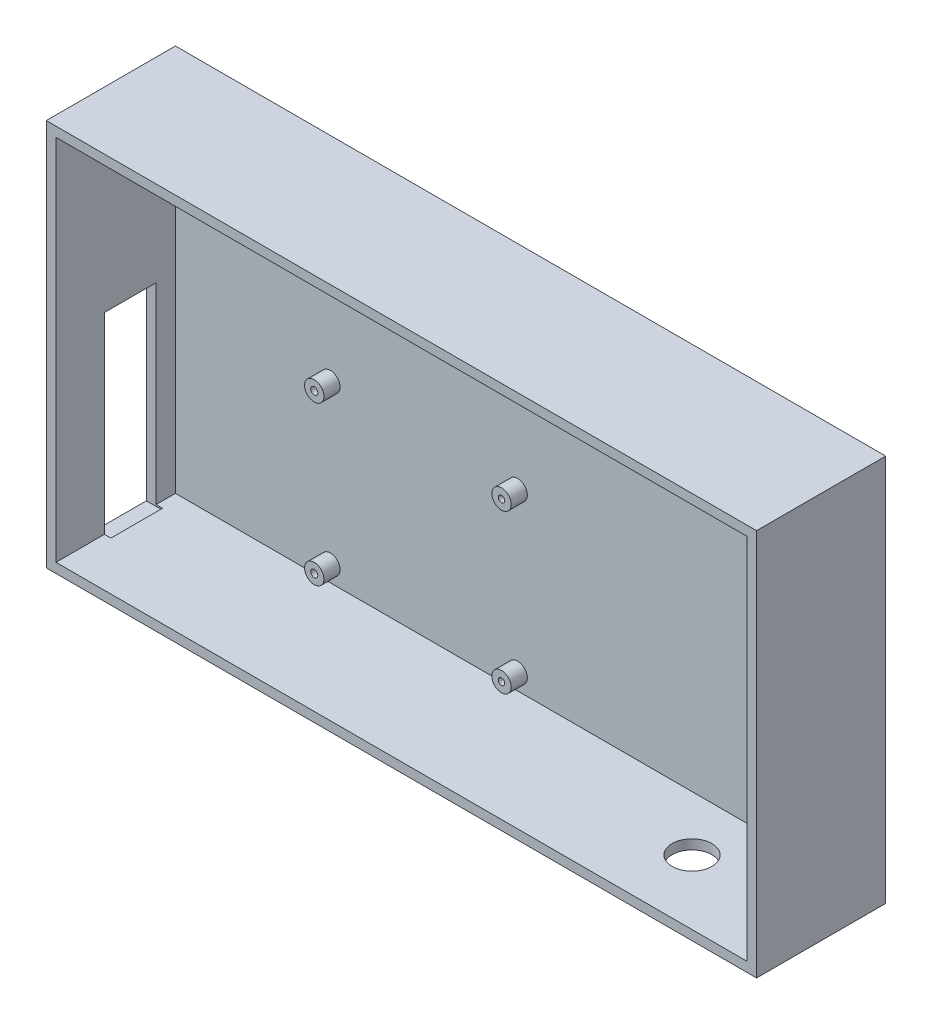
ISO-10303-21;
HEADER;
FILE_DESCRIPTION(('STEP AP214'),'2;1');
FILE_NAME('part.step','',(''),(''),'','','');
FILE_SCHEMA(('AUTOMOTIVE_DESIGN { 1 0 10303 214 1 1 1 1 }'));
ENDSEC;
DATA;
#1=APPLICATION_CONTEXT('core data for automotive mechanical design processes');
#2=APPLICATION_PROTOCOL_DEFINITION('international standard','automotive_design',2000,#1);
#3=PRODUCT_CONTEXT('',#1,'mechanical');
#4=PRODUCT('Part','Part','',(#3));
#5=PRODUCT_RELATED_PRODUCT_CATEGORY('part','',(#4));
#6=PRODUCT_DEFINITION_FORMATION('','',#4);
#7=PRODUCT_DEFINITION_CONTEXT('part definition',#1,'design');
#8=PRODUCT_DEFINITION('design','',#6,#7);
#9=PRODUCT_DEFINITION_SHAPE('','',#8);
#10=(LENGTH_UNIT() NAMED_UNIT(*) SI_UNIT(.MILLI.,.METRE.));
#11=(NAMED_UNIT(*) PLANE_ANGLE_UNIT() SI_UNIT($,.RADIAN.));
#12=(NAMED_UNIT(*) SI_UNIT($,.STERADIAN.) SOLID_ANGLE_UNIT());
#13=UNCERTAINTY_MEASURE_WITH_UNIT(LENGTH_MEASURE(1.E-05),#10,'distance_accuracy_value','');
#14=(GEOMETRIC_REPRESENTATION_CONTEXT(3) GLOBAL_UNCERTAINTY_ASSIGNED_CONTEXT((#13)) GLOBAL_UNIT_ASSIGNED_CONTEXT((#10,
#11,#12)) REPRESENTATION_CONTEXT('',''));
#15=CARTESIAN_POINT('',(0.,0.,0.));
#16=DIRECTION('',(0.,0.,1.));
#17=DIRECTION('',(1.,0.,0.));
#18=AXIS2_PLACEMENT_3D('',#15,#16,#17);
#19=CARTESIAN_POINT('',(-110.,-60.,40.));
#20=DIRECTION('',(1.,0.,0.));
#21=DIRECTION('',(0.,0.,-1.));
#22=AXIS2_PLACEMENT_3D('',#19,#20,#21);
#23=PLANE('',#22);
#24=DIRECTION('',(0.,-1.,0.));
#25=VECTOR('',#24,1.);
#26=CARTESIAN_POINT('',(-110.,-60.,0.));
#27=LINE('',#26,#25);
#28=CARTESIAN_POINT('',(-110.,60.,0.));
#29=VERTEX_POINT('',#28);
#30=CARTESIAN_POINT('',(-110.,-60.,0.));
#31=VERTEX_POINT('',#30);
#32=EDGE_CURVE('E248',#29,#31,#27,.T.);
#33=ORIENTED_EDGE('',*,*,#32,.T.);
#34=DIRECTION('',(0.,0.,-1.));
#35=VECTOR('',#34,1.);
#36=CARTESIAN_POINT('',(-110.,-60.,40.));
#37=LINE('',#36,#35);
#38=CARTESIAN_POINT('',(-110.,-60.,40.));
#39=VERTEX_POINT('',#38);
#40=EDGE_CURVE('E274',#39,#31,#37,.T.);
#41=ORIENTED_EDGE('',*,*,#40,.F.);
#42=DIRECTION('',(0.,-1.,0.));
#43=VECTOR('',#42,1.);
#44=CARTESIAN_POINT('',(-110.,-60.,40.));
#45=LINE('',#44,#43);
#46=CARTESIAN_POINT('',(-110.,60.,40.));
#47=VERTEX_POINT('',#46);
#48=EDGE_CURVE('E247',#47,#39,#45,.T.);
#49=ORIENTED_EDGE('',*,*,#48,.F.);
#50=DIRECTION('',(0.,0.,-1.));
#51=VECTOR('',#50,1.);
#52=CARTESIAN_POINT('',(-110.,60.,40.));
#53=LINE('',#52,#51);
#54=EDGE_CURVE('E259',#47,#29,#53,.T.);
#55=ORIENTED_EDGE('',*,*,#54,.T.);
#56=EDGE_LOOP('',(#33,#41,#49,#55));
#57=FACE_BOUND('',#56,.T.);
#58=DIRECTION('',(0.,1.,0.));
#59=VECTOR('',#58,1.);
#60=CARTESIAN_POINT('',(-110.,-60.,25.));
#61=LINE('',#60,#59);
#62=CARTESIAN_POINT('',(-110.,-57.5,25.));
#63=VERTEX_POINT('',#62);
#64=CARTESIAN_POINT('',(-110.,2.5,25.));
#65=VERTEX_POINT('',#64);
#66=EDGE_CURVE('E175',#63,#65,#61,.T.);
#67=ORIENTED_EDGE('',*,*,#66,.F.);
#68=DIRECTION('',(0.,0.,1.));
#69=VECTOR('',#68,1.);
#70=CARTESIAN_POINT('',(-110.,-57.5,40.));
#71=LINE('',#70,#69);
#72=CARTESIAN_POINT('',(-110.,-57.5,9.));
#73=VERTEX_POINT('',#72);
#74=EDGE_CURVE('E11',#73,#63,#71,.T.);
#75=ORIENTED_EDGE('',*,*,#74,.F.);
#76=DIRECTION('',(0.,1.,0.));
#77=VECTOR('',#76,1.);
#78=CARTESIAN_POINT('',(-110.,-60.,9.));
#79=LINE('',#78,#77);
#80=CARTESIAN_POINT('',(-110.,2.5,9.));
#81=VERTEX_POINT('',#80);
#82=EDGE_CURVE('E170',#73,#81,#79,.T.);
#83=ORIENTED_EDGE('',*,*,#82,.T.);
#84=DIRECTION('',(0.,0.,-1.));
#85=VECTOR('',#84,1.);
#86=CARTESIAN_POINT('',(-110.,2.5,40.));
#87=LINE('',#86,#85);
#88=EDGE_CURVE('E173',#65,#81,#87,.T.);
#89=ORIENTED_EDGE('',*,*,#88,.F.);
#90=EDGE_LOOP('',(#67,#75,#83,#89));
#91=FACE_BOUND('',#90,.T.);
#92=ADVANCED_FACE('F39',(#57,#91),#23,.F.);
#93=CARTESIAN_POINT('',(-107.,-57.,40.));
#94=DIRECTION('',(1.,0.,0.));
#95=DIRECTION('',(0.,0.,-1.));
#96=AXIS2_PLACEMENT_3D('',#93,#94,#95);
#97=PLANE('',#96);
#98=DIRECTION('',(0.,0.,-1.));
#99=VECTOR('',#98,1.);
#100=CARTESIAN_POINT('',(-107.,-57.,40.));
#101=LINE('',#100,#99);
#102=CARTESIAN_POINT('',(-107.,-57.,40.));
#103=VERTEX_POINT('',#102);
#104=CARTESIAN_POINT('',(-107.,-57.,25.));
#105=VERTEX_POINT('',#104);
#106=EDGE_CURVE('E243',#103,#105,#101,.T.);
#107=ORIENTED_EDGE('',*,*,#106,.T.);
#108=DIRECTION('',(0.,1.,0.));
#109=VECTOR('',#108,1.);
#110=CARTESIAN_POINT('',(-107.,-57.,25.));
#111=LINE('',#110,#109);
#112=CARTESIAN_POINT('',(-107.,2.5,25.));
#113=VERTEX_POINT('',#112);
#114=EDGE_CURVE('E168',#105,#113,#111,.T.);
#115=ORIENTED_EDGE('',*,*,#114,.T.);
#116=DIRECTION('',(0.,0.,-1.));
#117=VECTOR('',#116,1.);
#118=CARTESIAN_POINT('',(-107.,2.5,40.));
#119=LINE('',#118,#117);
#120=CARTESIAN_POINT('',(-107.,2.5,9.));
#121=VERTEX_POINT('',#120);
#122=EDGE_CURVE('E46',#113,#121,#119,.T.);
#123=ORIENTED_EDGE('',*,*,#122,.T.);
#124=DIRECTION('',(0.,1.,0.));
#125=VECTOR('',#124,1.);
#126=CARTESIAN_POINT('',(-107.,-57.,9.));
#127=LINE('',#126,#125);
#128=CARTESIAN_POINT('',(-107.,-57.,9.));
#129=VERTEX_POINT('',#128);
#130=EDGE_CURVE('E155',#129,#121,#127,.T.);
#131=ORIENTED_EDGE('',*,*,#130,.F.);
#132=CARTESIAN_POINT('',(-107.,-57.,3.));
#133=VERTEX_POINT('',#132);
#134=EDGE_CURVE('E241',#129,#133,#101,.T.);
#135=ORIENTED_EDGE('',*,*,#134,.T.);
#136=DIRECTION('',(0.,-1.,0.));
#137=VECTOR('',#136,1.);
#138=CARTESIAN_POINT('',(-107.,-57.,3.));
#139=LINE('',#138,#137);
#140=CARTESIAN_POINT('',(-107.,57.,3.));
#141=VERTEX_POINT('',#140);
#142=EDGE_CURVE('E220',#141,#133,#139,.T.);
#143=ORIENTED_EDGE('',*,*,#142,.F.);
#144=DIRECTION('',(0.,0.,-1.));
#145=VECTOR('',#144,1.);
#146=CARTESIAN_POINT('',(-107.,57.,40.));
#147=LINE('',#146,#145);
#148=CARTESIAN_POINT('',(-107.,57.,40.));
#149=VERTEX_POINT('',#148);
#150=EDGE_CURVE('E230',#149,#141,#147,.T.);
#151=ORIENTED_EDGE('',*,*,#150,.F.);
#152=DIRECTION('',(0.,-1.,0.));
#153=VECTOR('',#152,1.);
#154=CARTESIAN_POINT('',(-107.,-57.,40.));
#155=LINE('',#154,#153);
#156=EDGE_CURVE('E217',#149,#103,#155,.T.);
#157=ORIENTED_EDGE('',*,*,#156,.T.);
#158=EDGE_LOOP('',(#107,#115,#123,#131,#135,#143,#151,#157));
#159=FACE_BOUND('',#158,.T.);
#160=ADVANCED_FACE('F296',(#159),#97,.T.);
#161=CARTESIAN_POINT('',(-107.,-57.,40.));
#162=DIRECTION('',(0.,1.,0.));
#163=DIRECTION('',(0.,0.,1.));
#164=AXIS2_PLACEMENT_3D('',#161,#162,#163);
#165=PLANE('',#164);
#166=CARTESIAN_POINT('',(70.,-57.,20.));
#167=DIRECTION('',(0.,1.,0.));
#168=DIRECTION('',(0.,0.,1.));
#169=AXIS2_PLACEMENT_3D('',#166,#167,#168);
#170=CIRCLE('',#169,6.15000000000001);
#171=CARTESIAN_POINT('',(70.,-57.,26.15));
#172=VERTEX_POINT('',#171);
#173=EDGE_CURVE('E180',#172,#172,#170,.T.);
#174=ORIENTED_EDGE('',*,*,#173,.F.);
#175=EDGE_LOOP('',(#174));
#176=FACE_BOUND('',#175,.T.);
#177=DIRECTION('',(0.,0.,1.));
#178=VECTOR('',#177,1.);
#179=CARTESIAN_POINT('',(-105.,-57.,40.));
#180=LINE('',#179,#178);
#181=CARTESIAN_POINT('',(-105.,-57.,9.));
#182=VERTEX_POINT('',#181);
#183=CARTESIAN_POINT('',(-105.,-57.,25.));
#184=VERTEX_POINT('',#183);
#185=EDGE_CURVE('E294',#182,#184,#180,.T.);
#186=ORIENTED_EDGE('',*,*,#185,.T.);
#187=DIRECTION('',(-1.,0.,0.));
#188=VECTOR('',#187,1.);
#189=CARTESIAN_POINT('',(-107.,-57.,25.));
#190=LINE('',#189,#188);
#191=EDGE_CURVE('E160',#184,#105,#190,.T.);
#192=ORIENTED_EDGE('',*,*,#191,.T.);
#193=ORIENTED_EDGE('',*,*,#106,.F.);
#194=DIRECTION('',(1.,0.,0.));
#195=VECTOR('',#194,1.);
#196=CARTESIAN_POINT('',(-107.,-57.,40.));
#197=LINE('',#196,#195);
#198=CARTESIAN_POINT('',(107.,-57.,40.));
#199=VERTEX_POINT('',#198);
#200=EDGE_CURVE('E219',#103,#199,#197,.T.);
#201=ORIENTED_EDGE('',*,*,#200,.T.);
#202=DIRECTION('',(0.,0.,-1.));
#203=VECTOR('',#202,1.);
#204=CARTESIAN_POINT('',(107.,-57.,40.));
#205=LINE('',#204,#203);
#206=CARTESIAN_POINT('',(107.,-57.,3.));
#207=VERTEX_POINT('',#206);
#208=EDGE_CURVE('E242',#199,#207,#205,.T.);
#209=ORIENTED_EDGE('',*,*,#208,.T.);
#210=DIRECTION('',(1.,0.,0.));
#211=VECTOR('',#210,1.);
#212=CARTESIAN_POINT('',(-107.,-57.,3.));
#213=LINE('',#212,#211);
#214=EDGE_CURVE('E231',#133,#207,#213,.T.);
#215=ORIENTED_EDGE('',*,*,#214,.F.);
#216=ORIENTED_EDGE('',*,*,#134,.F.);
#217=DIRECTION('',(-1.,0.,0.));
#218=VECTOR('',#217,1.);
#219=CARTESIAN_POINT('',(-107.,-57.,9.));
#220=LINE('',#219,#218);
#221=EDGE_CURVE('E289',#182,#129,#220,.T.);
#222=ORIENTED_EDGE('',*,*,#221,.F.);
#223=EDGE_LOOP('',(#186,#192,#193,#201,#209,#215,#216,#222));
#224=FACE_BOUND('',#223,.T.);
#225=ADVANCED_FACE('F325',(#176,#224),#165,.T.);
#226=CARTESIAN_POINT('',(0.,0.,40.));
#227=DIRECTION('',(0.,0.,-1.));
#228=DIRECTION('',(-1.,0.,0.));
#229=AXIS2_PLACEMENT_3D('',#226,#227,#228);
#230=PLANE('',#229);
#231=ORIENTED_EDGE('',*,*,#48,.T.);
#232=DIRECTION('',(1.,0.,0.));
#233=VECTOR('',#232,1.);
#234=CARTESIAN_POINT('',(-110.,-60.,40.));
#235=LINE('',#234,#233);
#236=CARTESIAN_POINT('',(110.,-60.,40.));
#237=VERTEX_POINT('',#236);
#238=EDGE_CURVE('E252',#39,#237,#235,.T.);
#239=ORIENTED_EDGE('',*,*,#238,.T.);
#240=DIRECTION('',(0.,1.,0.));
#241=VECTOR('',#240,1.);
#242=CARTESIAN_POINT('',(110.,-60.,40.));
#243=LINE('',#242,#241);
#244=CARTESIAN_POINT('',(110.,60.,40.));
#245=VERTEX_POINT('',#244);
#246=EDGE_CURVE('E254',#237,#245,#243,.T.);
#247=ORIENTED_EDGE('',*,*,#246,.T.);
#248=DIRECTION('',(-1.,0.,0.));
#249=VECTOR('',#248,1.);
#250=CARTESIAN_POINT('',(-110.,60.,40.));
#251=LINE('',#250,#249);
#252=EDGE_CURVE('E260',#245,#47,#251,.T.);
#253=ORIENTED_EDGE('',*,*,#252,.T.);
#254=EDGE_LOOP('',(#231,#239,#247,#253));
#255=FACE_BOUND('',#254,.T.);
#256=ORIENTED_EDGE('',*,*,#156,.F.);
#257=DIRECTION('',(-1.,0.,0.));
#258=VECTOR('',#257,1.);
#259=CARTESIAN_POINT('',(-107.,57.,40.));
#260=LINE('',#259,#258);
#261=CARTESIAN_POINT('',(107.,57.,40.));
#262=VERTEX_POINT('',#261);
#263=EDGE_CURVE('E227',#262,#149,#260,.T.);
#264=ORIENTED_EDGE('',*,*,#263,.F.);
#265=DIRECTION('',(0.,1.,0.));
#266=VECTOR('',#265,1.);
#267=CARTESIAN_POINT('',(107.,-57.,40.));
#268=LINE('',#267,#266);
#269=EDGE_CURVE('E224',#199,#262,#268,.T.);
#270=ORIENTED_EDGE('',*,*,#269,.F.);
#271=ORIENTED_EDGE('',*,*,#200,.F.);
#272=EDGE_LOOP('',(#256,#264,#270,#271));
#273=FACE_BOUND('',#272,.T.);
#274=ADVANCED_FACE('F339',(#255,#273),#230,.F.);
#275=CARTESIAN_POINT('',(-110.,-60.,40.));
#276=DIRECTION('',(0.,1.,0.));
#277=DIRECTION('',(0.,0.,1.));
#278=AXIS2_PLACEMENT_3D('',#275,#276,#277);
#279=PLANE('',#278);
#280=CARTESIAN_POINT('',(70.,-60.,20.));
#281=DIRECTION('',(0.,1.,0.));
#282=DIRECTION('',(0.,0.,1.));
#283=AXIS2_PLACEMENT_3D('',#280,#281,#282);
#284=CIRCLE('',#283,6.15000000000001);
#285=CARTESIAN_POINT('',(70.,-60.,26.15));
#286=VERTEX_POINT('',#285);
#287=EDGE_CURVE('E178',#286,#286,#284,.T.);
#288=ORIENTED_EDGE('',*,*,#287,.T.);
#289=EDGE_LOOP('',(#288));
#290=FACE_BOUND('',#289,.T.);
#291=DIRECTION('',(1.,0.,0.));
#292=VECTOR('',#291,1.);
#293=CARTESIAN_POINT('',(-110.,-60.,0.));
#294=LINE('',#293,#292);
#295=CARTESIAN_POINT('',(110.,-60.,0.));
#296=VERTEX_POINT('',#295);
#297=EDGE_CURVE('E265',#31,#296,#294,.T.);
#298=ORIENTED_EDGE('',*,*,#297,.T.);
#299=DIRECTION('',(0.,0.,-1.));
#300=VECTOR('',#299,1.);
#301=CARTESIAN_POINT('',(110.,-60.,40.));
#302=LINE('',#301,#300);
#303=EDGE_CURVE('E275',#237,#296,#302,.T.);
#304=ORIENTED_EDGE('',*,*,#303,.F.);
#305=ORIENTED_EDGE('',*,*,#238,.F.);
#306=ORIENTED_EDGE('',*,*,#40,.T.);
#307=EDGE_LOOP('',(#298,#304,#305,#306));
#308=FACE_BOUND('',#307,.T.);
#309=ADVANCED_FACE('F331',(#290,#308),#279,.F.);
#310=CARTESIAN_POINT('',(110.,-60.,40.));
#311=DIRECTION('',(-1.,0.,0.));
#312=DIRECTION('',(0.,0.,1.));
#313=AXIS2_PLACEMENT_3D('',#310,#311,#312);
#314=PLANE('',#313);
#315=DIRECTION('',(0.,1.,0.));
#316=VECTOR('',#315,1.);
#317=CARTESIAN_POINT('',(110.,-60.,0.));
#318=LINE('',#317,#316);
#319=CARTESIAN_POINT('',(110.,60.,0.));
#320=VERTEX_POINT('',#319);
#321=EDGE_CURVE('E262',#296,#320,#318,.T.);
#322=ORIENTED_EDGE('',*,*,#321,.T.);
#323=DIRECTION('',(0.,0.,-1.));
#324=VECTOR('',#323,1.);
#325=CARTESIAN_POINT('',(110.,60.,40.));
#326=LINE('',#325,#324);
#327=EDGE_CURVE('E267',#245,#320,#326,.T.);
#328=ORIENTED_EDGE('',*,*,#327,.F.);
#329=ORIENTED_EDGE('',*,*,#246,.F.);
#330=ORIENTED_EDGE('',*,*,#303,.T.);
#331=EDGE_LOOP('',(#322,#328,#329,#330));
#332=FACE_BOUND('',#331,.T.);
#333=ADVANCED_FACE('F342',(#332),#314,.F.);
#334=CARTESIAN_POINT('',(-110.,60.,40.));
#335=DIRECTION('',(0.,-1.,0.));
#336=DIRECTION('',(0.,0.,-1.));
#337=AXIS2_PLACEMENT_3D('',#334,#335,#336);
#338=PLANE('',#337);
#339=DIRECTION('',(-1.,0.,0.));
#340=VECTOR('',#339,1.);
#341=CARTESIAN_POINT('',(-110.,60.,0.));
#342=LINE('',#341,#340);
#343=EDGE_CURVE('E251',#320,#29,#342,.T.);
#344=ORIENTED_EDGE('',*,*,#343,.T.);
#345=ORIENTED_EDGE('',*,*,#54,.F.);
#346=ORIENTED_EDGE('',*,*,#252,.F.);
#347=ORIENTED_EDGE('',*,*,#327,.T.);
#348=EDGE_LOOP('',(#344,#345,#346,#347));
#349=FACE_BOUND('',#348,.T.);
#350=ADVANCED_FACE('F345',(#349),#338,.F.);
#351=CARTESIAN_POINT('',(0.,0.,0.));
#352=DIRECTION('',(0.,0.,-1.));
#353=DIRECTION('',(-1.,0.,0.));
#354=AXIS2_PLACEMENT_3D('',#351,#352,#353);
#355=PLANE('',#354);
#356=ORIENTED_EDGE('',*,*,#32,.F.);
#357=ORIENTED_EDGE('',*,*,#343,.F.);
#358=ORIENTED_EDGE('',*,*,#321,.F.);
#359=ORIENTED_EDGE('',*,*,#297,.F.);
#360=EDGE_LOOP('',(#356,#357,#358,#359));
#361=FACE_BOUND('',#360,.T.);
#362=ADVANCED_FACE('F329',(#361),#355,.T.);
#363=CARTESIAN_POINT('',(107.,-57.,40.));
#364=DIRECTION('',(-1.,0.,0.));
#365=DIRECTION('',(0.,0.,1.));
#366=AXIS2_PLACEMENT_3D('',#363,#364,#365);
#367=PLANE('',#366);
#368=DIRECTION('',(0.,1.,0.));
#369=VECTOR('',#368,1.);
#370=CARTESIAN_POINT('',(107.,-57.,3.));
#371=LINE('',#370,#369);
#372=CARTESIAN_POINT('',(107.,57.,3.));
#373=VERTEX_POINT('',#372);
#374=EDGE_CURVE('E233',#207,#373,#371,.T.);
#375=ORIENTED_EDGE('',*,*,#374,.F.);
#376=ORIENTED_EDGE('',*,*,#208,.F.);
#377=ORIENTED_EDGE('',*,*,#269,.T.);
#378=DIRECTION('',(0.,0.,-1.));
#379=VECTOR('',#378,1.);
#380=CARTESIAN_POINT('',(107.,57.,40.));
#381=LINE('',#380,#379);
#382=EDGE_CURVE('E236',#262,#373,#381,.T.);
#383=ORIENTED_EDGE('',*,*,#382,.T.);
#384=EDGE_LOOP('',(#375,#376,#377,#383));
#385=FACE_BOUND('',#384,.T.);
#386=ADVANCED_FACE('F356',(#385),#367,.T.);
#387=CARTESIAN_POINT('',(-107.,57.,40.));
#388=DIRECTION('',(0.,-1.,0.));
#389=DIRECTION('',(0.,0.,-1.));
#390=AXIS2_PLACEMENT_3D('',#387,#388,#389);
#391=PLANE('',#390);
#392=DIRECTION('',(-1.,0.,0.));
#393=VECTOR('',#392,1.);
#394=CARTESIAN_POINT('',(-107.,57.,3.));
#395=LINE('',#394,#393);
#396=EDGE_CURVE('E222',#373,#141,#395,.T.);
#397=ORIENTED_EDGE('',*,*,#396,.F.);
#398=ORIENTED_EDGE('',*,*,#382,.F.);
#399=ORIENTED_EDGE('',*,*,#263,.T.);
#400=ORIENTED_EDGE('',*,*,#150,.T.);
#401=EDGE_LOOP('',(#397,#398,#399,#400));
#402=FACE_BOUND('',#401,.T.);
#403=ADVANCED_FACE('F365',(#402),#391,.T.);
#404=CARTESIAN_POINT('',(0.,0.,3.));
#405=DIRECTION('',(0.,0.,-1.));
#406=DIRECTION('',(-1.,0.,0.));
#407=AXIS2_PLACEMENT_3D('',#404,#405,#406);
#408=PLANE('',#407);
#409=CARTESIAN_POINT('',(-1.,-3.,3.));
#410=DIRECTION('',(0.,0.,-1.));
#411=DIRECTION('',(-1.,0.,0.));
#412=AXIS2_PLACEMENT_3D('',#409,#410,#411);
#413=CIRCLE('',#412,3.);
#414=CARTESIAN_POINT('',(-4.,-3.,3.));
#415=VERTEX_POINT('',#414);
#416=EDGE_CURVE('E290',#415,#415,#413,.F.);
#417=ORIENTED_EDGE('',*,*,#416,.F.);
#418=EDGE_LOOP('',(#417));
#419=FACE_BOUND('',#418,.T.);
#420=CARTESIAN_POINT('',(-1.,-52.,3.));
#421=DIRECTION('',(0.,0.,-1.));
#422=DIRECTION('',(-1.,0.,0.));
#423=AXIS2_PLACEMENT_3D('',#420,#421,#422);
#424=CIRCLE('',#423,3.);
#425=CARTESIAN_POINT('',(-4.,-52.,3.));
#426=VERTEX_POINT('',#425);
#427=EDGE_CURVE('E281',#426,#426,#424,.F.);
#428=ORIENTED_EDGE('',*,*,#427,.F.);
#429=EDGE_LOOP('',(#428));
#430=FACE_BOUND('',#429,.T.);
#431=CARTESIAN_POINT('',(-59.,-3.,3.));
#432=DIRECTION('',(0.,0.,-1.));
#433=DIRECTION('',(-1.,0.,0.));
#434=AXIS2_PLACEMENT_3D('',#431,#432,#433);
#435=CIRCLE('',#434,3.);
#436=CARTESIAN_POINT('',(-62.,-3.,3.));
#437=VERTEX_POINT('',#436);
#438=EDGE_CURVE('E282',#437,#437,#435,.F.);
#439=ORIENTED_EDGE('',*,*,#438,.F.);
#440=EDGE_LOOP('',(#439));
#441=FACE_BOUND('',#440,.T.);
#442=CARTESIAN_POINT('',(-59.,-52.,3.));
#443=DIRECTION('',(0.,0.,-1.));
#444=DIRECTION('',(-1.,0.,0.));
#445=AXIS2_PLACEMENT_3D('',#442,#443,#444);
#446=CIRCLE('',#445,3.);
#447=CARTESIAN_POINT('',(-62.,-52.,3.));
#448=VERTEX_POINT('',#447);
#449=EDGE_CURVE('E279',#448,#448,#446,.F.);
#450=ORIENTED_EDGE('',*,*,#449,.F.);
#451=EDGE_LOOP('',(#450));
#452=FACE_BOUND('',#451,.T.);
#453=ORIENTED_EDGE('',*,*,#142,.T.);
#454=ORIENTED_EDGE('',*,*,#214,.T.);
#455=ORIENTED_EDGE('',*,*,#374,.T.);
#456=ORIENTED_EDGE('',*,*,#396,.T.);
#457=EDGE_LOOP('',(#453,#454,#455,#456));
#458=FACE_BOUND('',#457,.T.);
#459=ADVANCED_FACE('F366',(#419,#430,#441,#452,#458),#408,.F.);
#460=CARTESIAN_POINT('',(-59.,-52.,8.));
#461=DIRECTION('',(0.,0.,-1.));
#462=DIRECTION('',(-1.,0.,0.));
#463=AXIS2_PLACEMENT_3D('',#460,#461,#462);
#464=CYLINDRICAL_SURFACE('',#463,3.);
#465=CARTESIAN_POINT('',(-59.,-52.,8.));
#466=DIRECTION('',(0.,0.,1.));
#467=DIRECTION('',(1.,0.,0.));
#468=AXIS2_PLACEMENT_3D('',#465,#466,#467);
#469=CIRCLE('',#468,3.);
#470=CARTESIAN_POINT('',(-56.,-52.,8.));
#471=VERTEX_POINT('',#470);
#472=EDGE_CURVE('E215',#471,#471,#469,.T.);
#473=ORIENTED_EDGE('',*,*,#472,.F.);
#474=EDGE_LOOP('',(#473));
#475=FACE_BOUND('',#474,.T.);
#476=ORIENTED_EDGE('',*,*,#449,.T.);
#477=EDGE_LOOP('',(#476));
#478=FACE_BOUND('',#477,.T.);
#479=ADVANCED_FACE('F375',(#475,#478),#464,.T.);
#480=CARTESIAN_POINT('',(-59.,-52.,8.));
#481=DIRECTION('',(0.,0.,1.));
#482=DIRECTION('',(1.,0.,0.));
#483=AXIS2_PLACEMENT_3D('',#480,#481,#482);
#484=PLANE('',#483);
#485=CARTESIAN_POINT('',(-59.,-52.,8.));
#486=DIRECTION('',(0.,0.,1.));
#487=DIRECTION('',(1.,0.,0.));
#488=AXIS2_PLACEMENT_3D('',#485,#486,#487);
#489=CIRCLE('',#488,1.1);
#490=CARTESIAN_POINT('',(-57.9,-52.,8.));
#491=VERTEX_POINT('',#490);
#492=EDGE_CURVE('E207',#491,#491,#489,.T.);
#493=ORIENTED_EDGE('',*,*,#492,.F.);
#494=EDGE_LOOP('',(#493));
#495=FACE_BOUND('',#494,.T.);
#496=ORIENTED_EDGE('',*,*,#472,.T.);
#497=EDGE_LOOP('',(#496));
#498=FACE_BOUND('',#497,.T.);
#499=ADVANCED_FACE('F376',(#495,#498),#484,.T.);
#500=CARTESIAN_POINT('',(-59.,-52.,8.));
#501=DIRECTION('',(0.,0.,-1.));
#502=DIRECTION('',(-1.,0.,0.));
#503=AXIS2_PLACEMENT_3D('',#500,#501,#502);
#504=CYLINDRICAL_SURFACE('',#503,1.1);
#505=ORIENTED_EDGE('',*,*,#492,.T.);
#506=EDGE_LOOP('',(#505));
#507=FACE_BOUND('',#506,.T.);
#508=CARTESIAN_POINT('',(-59.,-52.,3.));
#509=DIRECTION('',(0.,0.,1.));
#510=DIRECTION('',(1.,0.,0.));
#511=AXIS2_PLACEMENT_3D('',#508,#509,#510);
#512=CIRCLE('',#511,1.1);
#513=CARTESIAN_POINT('',(-57.9,-52.,3.));
#514=VERTEX_POINT('',#513);
#515=EDGE_CURVE('E208',#514,#514,#512,.T.);
#516=ORIENTED_EDGE('',*,*,#515,.F.);
#517=EDGE_LOOP('',(#516));
#518=FACE_BOUND('',#517,.T.);
#519=ADVANCED_FACE('F379',(#507,#518),#504,.F.);
#520=CARTESIAN_POINT('',(-59.,-52.,3.));
#521=DIRECTION('',(0.,0.,1.));
#522=DIRECTION('',(1.,0.,0.));
#523=AXIS2_PLACEMENT_3D('',#520,#521,#522);
#524=PLANE('',#523);
#525=ORIENTED_EDGE('',*,*,#515,.T.);
#526=EDGE_LOOP('',(#525));
#527=FACE_BOUND('',#526,.T.);
#528=ADVANCED_FACE('F383',(#527),#524,.T.);
#529=CARTESIAN_POINT('',(-59.,-3.,8.));
#530=DIRECTION('',(0.,0.,-1.));
#531=DIRECTION('',(-1.,0.,0.));
#532=AXIS2_PLACEMENT_3D('',#529,#530,#531);
#533=CYLINDRICAL_SURFACE('',#532,3.);
#534=CARTESIAN_POINT('',(-59.,-3.,8.));
#535=DIRECTION('',(0.,0.,1.));
#536=DIRECTION('',(1.,0.,0.));
#537=AXIS2_PLACEMENT_3D('',#534,#535,#536);
#538=CIRCLE('',#537,3.);
#539=CARTESIAN_POINT('',(-56.,-3.,8.));
#540=VERTEX_POINT('',#539);
#541=EDGE_CURVE('E201',#540,#540,#538,.T.);
#542=ORIENTED_EDGE('',*,*,#541,.F.);
#543=EDGE_LOOP('',(#542));
#544=FACE_BOUND('',#543,.T.);
#545=ORIENTED_EDGE('',*,*,#438,.T.);
#546=EDGE_LOOP('',(#545));
#547=FACE_BOUND('',#546,.T.);
#548=ADVANCED_FACE('F389',(#544,#547),#533,.T.);
#549=CARTESIAN_POINT('',(-59.,-3.,8.));
#550=DIRECTION('',(0.,0.,1.));
#551=DIRECTION('',(1.,0.,0.));
#552=AXIS2_PLACEMENT_3D('',#549,#550,#551);
#553=PLANE('',#552);
#554=CARTESIAN_POINT('',(-59.,-3.,8.));
#555=DIRECTION('',(0.,0.,1.));
#556=DIRECTION('',(1.,0.,0.));
#557=AXIS2_PLACEMENT_3D('',#554,#555,#556);
#558=CIRCLE('',#557,1.1);
#559=CARTESIAN_POINT('',(-57.9,-3.,8.));
#560=VERTEX_POINT('',#559);
#561=EDGE_CURVE('E199',#560,#560,#558,.T.);
#562=ORIENTED_EDGE('',*,*,#561,.F.);
#563=EDGE_LOOP('',(#562));
#564=FACE_BOUND('',#563,.T.);
#565=ORIENTED_EDGE('',*,*,#541,.T.);
#566=EDGE_LOOP('',(#565));
#567=FACE_BOUND('',#566,.T.);
#568=ADVANCED_FACE('F394',(#564,#567),#553,.T.);
#569=CARTESIAN_POINT('',(-59.,-3.,8.));
#570=DIRECTION('',(0.,0.,-1.));
#571=DIRECTION('',(-1.,0.,0.));
#572=AXIS2_PLACEMENT_3D('',#569,#570,#571);
#573=CYLINDRICAL_SURFACE('',#572,1.1);
#574=ORIENTED_EDGE('',*,*,#561,.T.);
#575=EDGE_LOOP('',(#574));
#576=FACE_BOUND('',#575,.T.);
#577=CARTESIAN_POINT('',(-59.,-3.,3.));
#578=DIRECTION('',(0.,0.,1.));
#579=DIRECTION('',(1.,0.,0.));
#580=AXIS2_PLACEMENT_3D('',#577,#578,#579);
#581=CIRCLE('',#580,1.1);
#582=CARTESIAN_POINT('',(-57.9,-3.,3.));
#583=VERTEX_POINT('',#582);
#584=EDGE_CURVE('E200',#583,#583,#581,.T.);
#585=ORIENTED_EDGE('',*,*,#584,.F.);
#586=EDGE_LOOP('',(#585));
#587=FACE_BOUND('',#586,.T.);
#588=ADVANCED_FACE('F396',(#576,#587),#573,.F.);
#589=CARTESIAN_POINT('',(-59.,-3.,3.));
#590=DIRECTION('',(0.,0.,1.));
#591=DIRECTION('',(1.,0.,0.));
#592=AXIS2_PLACEMENT_3D('',#589,#590,#591);
#593=PLANE('',#592);
#594=ORIENTED_EDGE('',*,*,#584,.T.);
#595=EDGE_LOOP('',(#594));
#596=FACE_BOUND('',#595,.T.);
#597=ADVANCED_FACE('F399',(#596),#593,.T.);
#598=CARTESIAN_POINT('',(-1.,-52.,8.));
#599=DIRECTION('',(0.,0.,-1.));
#600=DIRECTION('',(-1.,0.,0.));
#601=AXIS2_PLACEMENT_3D('',#598,#599,#600);
#602=CYLINDRICAL_SURFACE('',#601,3.);
#603=CARTESIAN_POINT('',(-1.,-52.,8.));
#604=DIRECTION('',(0.,0.,1.));
#605=DIRECTION('',(1.,0.,0.));
#606=AXIS2_PLACEMENT_3D('',#603,#604,#605);
#607=CIRCLE('',#606,3.);
#608=CARTESIAN_POINT('',(2.,-52.,8.));
#609=VERTEX_POINT('',#608);
#610=EDGE_CURVE('E192',#609,#609,#607,.T.);
#611=ORIENTED_EDGE('',*,*,#610,.F.);
#612=EDGE_LOOP('',(#611));
#613=FACE_BOUND('',#612,.T.);
#614=ORIENTED_EDGE('',*,*,#427,.T.);
#615=EDGE_LOOP('',(#614));
#616=FACE_BOUND('',#615,.T.);
#617=ADVANCED_FACE('F404',(#613,#616),#602,.T.);
#618=CARTESIAN_POINT('',(-1.,-52.,8.));
#619=DIRECTION('',(0.,0.,1.));
#620=DIRECTION('',(1.,0.,0.));
#621=AXIS2_PLACEMENT_3D('',#618,#619,#620);
#622=PLANE('',#621);
#623=CARTESIAN_POINT('',(-1.,-52.,8.));
#624=DIRECTION('',(0.,0.,1.));
#625=DIRECTION('',(1.,0.,0.));
#626=AXIS2_PLACEMENT_3D('',#623,#624,#625);
#627=CIRCLE('',#626,1.);
#628=CARTESIAN_POINT('',(0.,-52.,8.));
#629=VERTEX_POINT('',#628);
#630=EDGE_CURVE('E191',#629,#629,#627,.T.);
#631=ORIENTED_EDGE('',*,*,#630,.F.);
#632=EDGE_LOOP('',(#631));
#633=FACE_BOUND('',#632,.T.);
#634=ORIENTED_EDGE('',*,*,#610,.T.);
#635=EDGE_LOOP('',(#634));
#636=FACE_BOUND('',#635,.T.);
#637=ADVANCED_FACE('F410',(#633,#636),#622,.T.);
#638=CARTESIAN_POINT('',(-1.,-52.,8.));
#639=DIRECTION('',(0.,0.,-1.));
#640=DIRECTION('',(-1.,0.,0.));
#641=AXIS2_PLACEMENT_3D('',#638,#639,#640);
#642=CYLINDRICAL_SURFACE('',#641,1.);
#643=ORIENTED_EDGE('',*,*,#630,.T.);
#644=EDGE_LOOP('',(#643));
#645=FACE_BOUND('',#644,.T.);
#646=CARTESIAN_POINT('',(-1.,-52.,3.));
#647=DIRECTION('',(0.,0.,1.));
#648=DIRECTION('',(1.,0.,0.));
#649=AXIS2_PLACEMENT_3D('',#646,#647,#648);
#650=CIRCLE('',#649,1.);
#651=CARTESIAN_POINT('',(0.,-52.,3.));
#652=VERTEX_POINT('',#651);
#653=EDGE_CURVE('E188',#652,#652,#650,.T.);
#654=ORIENTED_EDGE('',*,*,#653,.F.);
#655=EDGE_LOOP('',(#654));
#656=FACE_BOUND('',#655,.T.);
#657=ADVANCED_FACE('F415',(#645,#656),#642,.F.);
#658=CARTESIAN_POINT('',(-1.,-52.,3.));
#659=DIRECTION('',(0.,0.,1.));
#660=DIRECTION('',(1.,0.,0.));
#661=AXIS2_PLACEMENT_3D('',#658,#659,#660);
#662=PLANE('',#661);
#663=ORIENTED_EDGE('',*,*,#653,.T.);
#664=EDGE_LOOP('',(#663));
#665=FACE_BOUND('',#664,.T.);
#666=ADVANCED_FACE('F418',(#665),#662,.T.);
#667=CARTESIAN_POINT('',(-1.,-3.,8.));
#668=DIRECTION('',(0.,0.,-1.));
#669=DIRECTION('',(-1.,0.,0.));
#670=AXIS2_PLACEMENT_3D('',#667,#668,#669);
#671=CYLINDRICAL_SURFACE('',#670,3.);
#672=CARTESIAN_POINT('',(-1.,-3.,8.));
#673=DIRECTION('',(0.,0.,1.));
#674=DIRECTION('',(1.,0.,0.));
#675=AXIS2_PLACEMENT_3D('',#672,#673,#674);
#676=CIRCLE('',#675,3.);
#677=CARTESIAN_POINT('',(2.,-3.,8.));
#678=VERTEX_POINT('',#677);
#679=EDGE_CURVE('E183',#678,#678,#676,.T.);
#680=ORIENTED_EDGE('',*,*,#679,.F.);
#681=EDGE_LOOP('',(#680));
#682=FACE_BOUND('',#681,.T.);
#683=ORIENTED_EDGE('',*,*,#416,.T.);
#684=EDGE_LOOP('',(#683));
#685=FACE_BOUND('',#684,.T.);
#686=ADVANCED_FACE('F419',(#682,#685),#671,.T.);
#687=CARTESIAN_POINT('',(-1.,-3.,8.));
#688=DIRECTION('',(0.,0.,1.));
#689=DIRECTION('',(1.,0.,0.));
#690=AXIS2_PLACEMENT_3D('',#687,#688,#689);
#691=PLANE('',#690);
#692=CARTESIAN_POINT('',(-1.,-3.,8.));
#693=DIRECTION('',(0.,0.,1.));
#694=DIRECTION('',(1.,0.,0.));
#695=AXIS2_PLACEMENT_3D('',#692,#693,#694);
#696=CIRCLE('',#695,1.);
#697=CARTESIAN_POINT('',(0.,-3.,8.));
#698=VERTEX_POINT('',#697);
#699=EDGE_CURVE('E185',#698,#698,#696,.T.);
#700=ORIENTED_EDGE('',*,*,#699,.F.);
#701=EDGE_LOOP('',(#700));
#702=FACE_BOUND('',#701,.T.);
#703=ORIENTED_EDGE('',*,*,#679,.T.);
#704=EDGE_LOOP('',(#703));
#705=FACE_BOUND('',#704,.T.);
#706=ADVANCED_FACE('F424',(#702,#705),#691,.T.);
#707=CARTESIAN_POINT('',(-1.,-3.,8.));
#708=DIRECTION('',(0.,0.,-1.));
#709=DIRECTION('',(-1.,0.,0.));
#710=AXIS2_PLACEMENT_3D('',#707,#708,#709);
#711=CYLINDRICAL_SURFACE('',#710,1.);
#712=ORIENTED_EDGE('',*,*,#699,.T.);
#713=EDGE_LOOP('',(#712));
#714=FACE_BOUND('',#713,.T.);
#715=CARTESIAN_POINT('',(-1.,-3.,3.));
#716=DIRECTION('',(0.,0.,1.));
#717=DIRECTION('',(1.,0.,0.));
#718=AXIS2_PLACEMENT_3D('',#715,#716,#717);
#719=CIRCLE('',#718,1.);
#720=CARTESIAN_POINT('',(0.,-3.,3.));
#721=VERTEX_POINT('',#720);
#722=EDGE_CURVE('E182',#721,#721,#719,.T.);
#723=ORIENTED_EDGE('',*,*,#722,.F.);
#724=EDGE_LOOP('',(#723));
#725=FACE_BOUND('',#724,.T.);
#726=ADVANCED_FACE('F428',(#714,#725),#711,.F.);
#727=CARTESIAN_POINT('',(-1.,-3.,3.));
#728=DIRECTION('',(0.,0.,1.));
#729=DIRECTION('',(1.,0.,0.));
#730=AXIS2_PLACEMENT_3D('',#727,#728,#729);
#731=PLANE('',#730);
#732=ORIENTED_EDGE('',*,*,#722,.T.);
#733=EDGE_LOOP('',(#732));
#734=FACE_BOUND('',#733,.T.);
#735=ADVANCED_FACE('F435',(#734),#731,.T.);
#736=CARTESIAN_POINT('',(70.,-61.,20.));
#737=DIRECTION('',(0.,1.,0.));
#738=DIRECTION('',(0.,0.,1.));
#739=AXIS2_PLACEMENT_3D('',#736,#737,#738);
#740=CYLINDRICAL_SURFACE('',#739,6.15000000000001);
#741=CARTESIAN_POINT('',(70.,-57.,26.15));
#742=CARTESIAN_POINT('',(70.,-57.03125,26.15));
#743=CARTESIAN_POINT('',(70.,-57.0625,26.15));
#744=CARTESIAN_POINT('',(70.,-57.125,26.15));
#745=CARTESIAN_POINT('',(70.,-57.15625,26.15));
#746=CARTESIAN_POINT('',(70.,-57.21875,26.15));
#747=CARTESIAN_POINT('',(70.,-57.25,26.15));
#748=CARTESIAN_POINT('',(70.,-57.3125,26.15));
#749=CARTESIAN_POINT('',(70.,-57.34375,26.15));
#750=CARTESIAN_POINT('',(70.,-57.40625,26.15));
#751=CARTESIAN_POINT('',(70.,-57.4375,26.15));
#752=CARTESIAN_POINT('',(70.,-57.5,26.15));
#753=CARTESIAN_POINT('',(70.,-57.53125,26.15));
#754=CARTESIAN_POINT('',(70.,-57.59375,26.15));
#755=CARTESIAN_POINT('',(70.,-57.625,26.15));
#756=CARTESIAN_POINT('',(70.,-57.6875,26.15));
#757=CARTESIAN_POINT('',(70.,-57.71875,26.15));
#758=CARTESIAN_POINT('',(70.,-57.78125,26.15));
#759=CARTESIAN_POINT('',(70.,-57.8125,26.15));
#760=CARTESIAN_POINT('',(70.,-57.875,26.15));
#761=CARTESIAN_POINT('',(70.,-57.90625,26.15));
#762=CARTESIAN_POINT('',(70.,-57.96875,26.15));
#763=CARTESIAN_POINT('',(70.,-58.,26.15));
#764=CARTESIAN_POINT('',(70.,-58.0625,26.15));
#765=CARTESIAN_POINT('',(70.,-58.09375,26.15));
#766=CARTESIAN_POINT('',(70.,-58.15625,26.15));
#767=CARTESIAN_POINT('',(70.,-58.1875,26.15));
#768=CARTESIAN_POINT('',(70.,-58.25,26.15));
#769=CARTESIAN_POINT('',(70.,-58.28125,26.15));
#770=CARTESIAN_POINT('',(70.,-58.34375,26.15));
#771=CARTESIAN_POINT('',(70.,-58.375,26.15));
#772=CARTESIAN_POINT('',(70.,-58.4375,26.15));
#773=CARTESIAN_POINT('',(70.,-58.46875,26.15));
#774=CARTESIAN_POINT('',(70.,-58.53125,26.15));
#775=CARTESIAN_POINT('',(70.,-58.5625,26.15));
#776=CARTESIAN_POINT('',(70.,-58.625,26.15));
#777=CARTESIAN_POINT('',(70.,-58.65625,26.15));
#778=CARTESIAN_POINT('',(70.,-58.71875,26.15));
#779=CARTESIAN_POINT('',(70.,-58.75,26.15));
#780=CARTESIAN_POINT('',(70.,-58.8125,26.15));
#781=CARTESIAN_POINT('',(70.,-58.84375,26.15));
#782=CARTESIAN_POINT('',(70.,-58.90625,26.15));
#783=CARTESIAN_POINT('',(70.,-58.9375,26.15));
#784=CARTESIAN_POINT('',(70.,-59.,26.15));
#785=CARTESIAN_POINT('',(70.,-59.03125,26.15));
#786=CARTESIAN_POINT('',(70.,-59.09375,26.15));
#787=CARTESIAN_POINT('',(70.,-59.125,26.15));
#788=CARTESIAN_POINT('',(70.,-59.1875,26.15));
#789=CARTESIAN_POINT('',(70.,-59.21875,26.15));
#790=CARTESIAN_POINT('',(70.,-59.28125,26.15));
#791=CARTESIAN_POINT('',(70.,-59.3125,26.15));
#792=CARTESIAN_POINT('',(70.,-59.375,26.15));
#793=CARTESIAN_POINT('',(70.,-59.40625,26.15));
#794=CARTESIAN_POINT('',(70.,-59.46875,26.15));
#795=CARTESIAN_POINT('',(70.,-59.5,26.15));
#796=CARTESIAN_POINT('',(70.,-59.5625,26.15));
#797=CARTESIAN_POINT('',(70.,-59.59375,26.15));
#798=CARTESIAN_POINT('',(70.,-59.65625,26.15));
#799=CARTESIAN_POINT('',(70.,-59.6875,26.15));
#800=CARTESIAN_POINT('',(70.,-59.75,26.15));
#801=CARTESIAN_POINT('',(70.,-59.78125,26.15));
#802=CARTESIAN_POINT('',(70.,-59.84375,26.15));
#803=CARTESIAN_POINT('',(70.,-59.875,26.15));
#804=CARTESIAN_POINT('',(70.,-59.9375,26.15));
#805=CARTESIAN_POINT('',(70.,-59.96875,26.15));
#806=CARTESIAN_POINT('',(70.,-60.,26.15));
#807=B_SPLINE_CURVE_WITH_KNOTS('',3,(#741,#742,#743,#744,#745,#746,#747,#748,#749,#750,#751,
#752,#753,#754,#755,#756,#757,#758,#759,#760,#761,#762,#763,#764,#765,#766,#767,#768,#769,#770,
#771,#772,#773,#774,#775,#776,#777,#778,#779,#780,#781,#782,#783,#784,#785,#786,#787,#788,#789,
#790,#791,#792,#793,#794,#795,#796,#797,#798,#799,#800,#801,#802,#803,#804,#805,#806),
.UNSPECIFIED.,.F.,.F.,(4,2,2,2,2,2,2,2,2,2,2,2,2,2,2,2,2,2,2,2,2,2,2,2,2,2,2,2,2,2,2,2,4),(0.,
0.0937500000000036,0.1875,0.281250000000004,0.375,0.468750000000004,0.5625,0.656250000000004,
0.750000000000001,0.843750000000004,0.937500000000001,1.03125,1.125,1.21875,1.3125,1.40625,1.5,
1.59375,1.6875,1.78125,1.875,1.96875,2.0625,2.15625,2.25,2.34375,2.4375,2.53125,2.625,2.71875,
2.8125,2.90625,3.),.UNSPECIFIED.);
#808=EDGE_CURVE('BSEAM436',#172,#286,#807,.T.);
#809=ORIENTED_EDGE('',*,*,#173,.T.);
#810=ORIENTED_EDGE('',*,*,#287,.F.);
#811=ORIENTED_EDGE('',*,*,#808,.T.);
#812=ORIENTED_EDGE('',*,*,#808,.F.);
#813=EDGE_LOOP('',(#809,#811,#810,#812));
#814=FACE_BOUND('',#813,.T.);
#815=ADVANCED_FACE('F436',(#814),#740,.F.);
#816=CARTESIAN_POINT('',(-112.,-57.5,25.));
#817=DIRECTION('',(0.,1.,0.));
#818=DIRECTION('',(0.,0.,1.));
#819=AXIS2_PLACEMENT_3D('',#816,#817,#818);
#820=PLANE('',#819);
#821=ORIENTED_EDGE('',*,*,#74,.T.);
#822=DIRECTION('',(1.,0.,0.));
#823=VECTOR('',#822,1.);
#824=CARTESIAN_POINT('',(-112.,-57.5,25.));
#825=LINE('',#824,#823);
#826=CARTESIAN_POINT('',(-105.,-57.5,25.));
#827=VERTEX_POINT('',#826);
#828=EDGE_CURVE('E140',#63,#827,#825,.T.);
#829=ORIENTED_EDGE('',*,*,#828,.T.);
#830=DIRECTION('',(0.,0.,-1.));
#831=VECTOR('',#830,1.);
#832=CARTESIAN_POINT('',(-105.,-57.5,25.));
#833=LINE('',#832,#831);
#834=CARTESIAN_POINT('',(-105.,-57.5,9.));
#835=VERTEX_POINT('',#834);
#836=EDGE_CURVE('E143',#827,#835,#833,.T.);
#837=ORIENTED_EDGE('',*,*,#836,.T.);
#838=DIRECTION('',(1.,0.,0.));
#839=VECTOR('',#838,1.);
#840=CARTESIAN_POINT('',(-112.,-57.5,9.));
#841=LINE('',#840,#839);
#842=EDGE_CURVE('E165',#73,#835,#841,.T.);
#843=ORIENTED_EDGE('',*,*,#842,.F.);
#844=EDGE_LOOP('',(#821,#829,#837,#843));
#845=FACE_BOUND('',#844,.T.);
#846=ADVANCED_FACE('F137',(#845),#820,.T.);
#847=CARTESIAN_POINT('',(-112.,2.5,25.));
#848=DIRECTION('',(0.,-1.,0.));
#849=DIRECTION('',(0.,0.,-1.));
#850=AXIS2_PLACEMENT_3D('',#847,#848,#849);
#851=PLANE('',#850);
#852=ORIENTED_EDGE('',*,*,#88,.T.);
#853=DIRECTION('',(-1.,0.,0.));
#854=VECTOR('',#853,1.);
#855=CARTESIAN_POINT('',(-112.,2.5,9.));
#856=LINE('',#855,#854);
#857=EDGE_CURVE('E52',#121,#81,#856,.T.);
#858=ORIENTED_EDGE('',*,*,#857,.F.);
#859=ORIENTED_EDGE('',*,*,#122,.F.);
#860=DIRECTION('',(-1.,0.,0.));
#861=VECTOR('',#860,1.);
#862=CARTESIAN_POINT('',(-112.,2.5,25.));
#863=LINE('',#862,#861);
#864=EDGE_CURVE('E153',#113,#65,#863,.T.);
#865=ORIENTED_EDGE('',*,*,#864,.T.);
#866=EDGE_LOOP('',(#852,#858,#859,#865));
#867=FACE_BOUND('',#866,.T.);
#868=ADVANCED_FACE('F303',(#867),#851,.T.);
#869=CARTESIAN_POINT('',(0.,0.,25.));
#870=DIRECTION('',(0.,0.,-1.));
#871=DIRECTION('',(-1.,0.,0.));
#872=AXIS2_PLACEMENT_3D('',#869,#870,#871);
#873=PLANE('',#872);
#874=ORIENTED_EDGE('',*,*,#66,.T.);
#875=ORIENTED_EDGE('',*,*,#864,.F.);
#876=ORIENTED_EDGE('',*,*,#114,.F.);
#877=ORIENTED_EDGE('',*,*,#191,.F.);
#878=DIRECTION('',(0.,1.,0.));
#879=VECTOR('',#878,1.);
#880=CARTESIAN_POINT('',(-105.,-57.5,25.));
#881=LINE('',#880,#879);
#882=EDGE_CURVE('E148',#827,#184,#881,.T.);
#883=ORIENTED_EDGE('',*,*,#882,.F.);
#884=ORIENTED_EDGE('',*,*,#828,.F.);
#885=EDGE_LOOP('',(#874,#875,#876,#877,#883,#884));
#886=FACE_BOUND('',#885,.T.);
#887=ADVANCED_FACE('F154',(#886),#873,.T.);
#888=CARTESIAN_POINT('',(0.,0.,9.));
#889=DIRECTION('',(0.,0.,-1.));
#890=DIRECTION('',(-1.,0.,0.));
#891=AXIS2_PLACEMENT_3D('',#888,#889,#890);
#892=PLANE('',#891);
#893=ORIENTED_EDGE('',*,*,#842,.T.);
#894=DIRECTION('',(0.,1.,0.));
#895=VECTOR('',#894,1.);
#896=CARTESIAN_POINT('',(-105.,-57.5,9.));
#897=LINE('',#896,#895);
#898=EDGE_CURVE('E58',#835,#182,#897,.T.);
#899=ORIENTED_EDGE('',*,*,#898,.T.);
#900=ORIENTED_EDGE('',*,*,#221,.T.);
#901=ORIENTED_EDGE('',*,*,#130,.T.);
#902=ORIENTED_EDGE('',*,*,#857,.T.);
#903=ORIENTED_EDGE('',*,*,#82,.F.);
#904=EDGE_LOOP('',(#893,#899,#900,#901,#902,#903));
#905=FACE_BOUND('',#904,.T.);
#906=ADVANCED_FACE('F308',(#905),#892,.F.);
#907=CARTESIAN_POINT('',(-105.,-57.5,25.));
#908=DIRECTION('',(-1.,0.,0.));
#909=DIRECTION('',(0.,0.,1.));
#910=AXIS2_PLACEMENT_3D('',#907,#908,#909);
#911=PLANE('',#910);
#912=ORIENTED_EDGE('',*,*,#898,.F.);
#913=ORIENTED_EDGE('',*,*,#836,.F.);
#914=ORIENTED_EDGE('',*,*,#882,.T.);
#915=ORIENTED_EDGE('',*,*,#185,.F.);
#916=EDGE_LOOP('',(#912,#913,#914,#915));
#917=FACE_BOUND('',#916,.T.);
#918=ADVANCED_FACE('F147',(#917),#911,.T.);
#919=CLOSED_SHELL('',(#92,#160,#225,#274,#309,#333,#350,#362,#386,#403,#459,#479,#499,#519,#528,
#548,#568,#588,#597,#617,#637,#657,#666,#686,#706,#726,#735,#815,#846,#868,#887,#906,#918));
#920=MANIFOLD_SOLID_BREP('B2',#919);
#921=ADVANCED_BREP_SHAPE_REPRESENTATION('',(#18,#920),#14);
#922=SHAPE_DEFINITION_REPRESENTATION(#9,#921);
ENDSEC;
END-ISO-10303-21;
